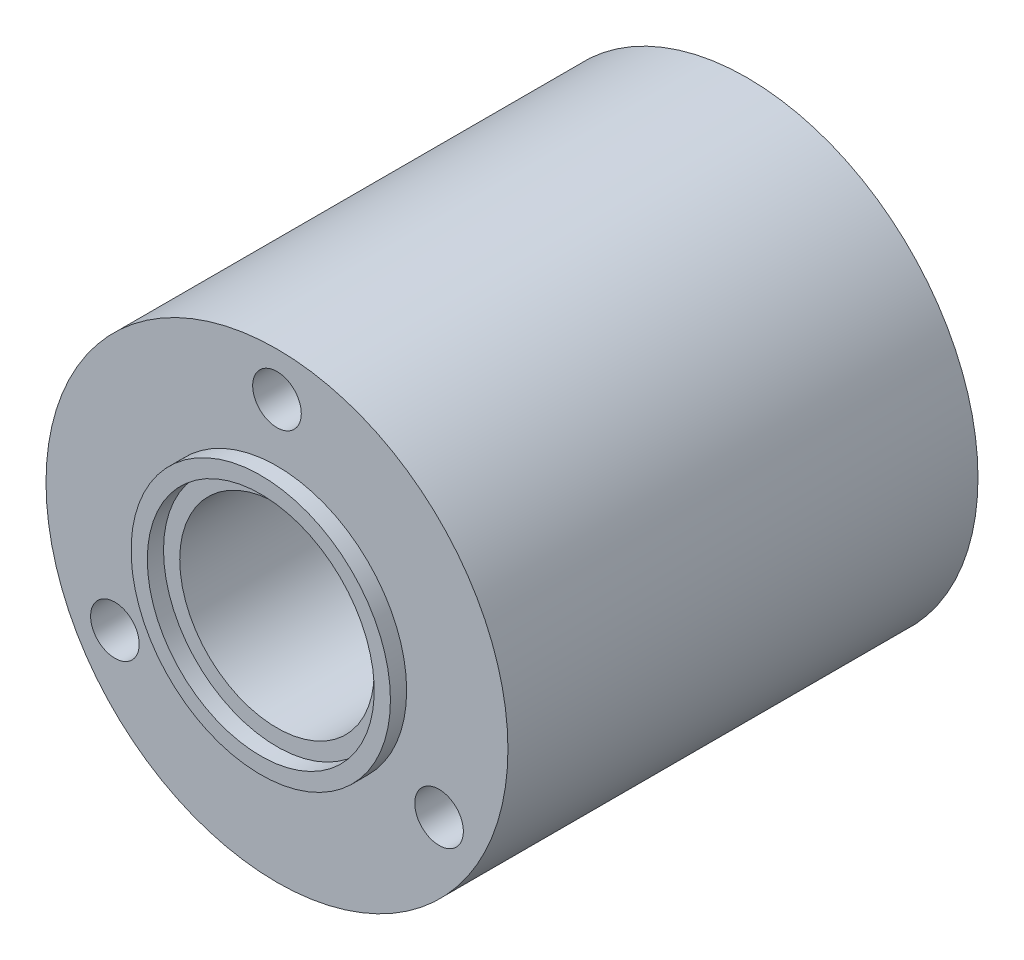
ISO-10303-21;
HEADER;
FILE_DESCRIPTION(('STEP AP214'),'2;1');
FILE_NAME('part.step','',(''),(''),'','','');
FILE_SCHEMA(('AUTOMOTIVE_DESIGN { 1 0 10303 214 1 1 1 1 }'));
ENDSEC;
DATA;
#1=APPLICATION_CONTEXT('core data for automotive mechanical design processes');
#2=APPLICATION_PROTOCOL_DEFINITION('international standard','automotive_design',2000,#1);
#3=PRODUCT_CONTEXT('',#1,'mechanical');
#4=PRODUCT('Part','Part','',(#3));
#5=PRODUCT_RELATED_PRODUCT_CATEGORY('part','',(#4));
#6=PRODUCT_DEFINITION_FORMATION('','',#4);
#7=PRODUCT_DEFINITION_CONTEXT('part definition',#1,'design');
#8=PRODUCT_DEFINITION('design','',#6,#7);
#9=PRODUCT_DEFINITION_SHAPE('','',#8);
#10=(LENGTH_UNIT() NAMED_UNIT(*) SI_UNIT(.MILLI.,.METRE.));
#11=(NAMED_UNIT(*) PLANE_ANGLE_UNIT() SI_UNIT($,.RADIAN.));
#12=(NAMED_UNIT(*) SI_UNIT($,.STERADIAN.) SOLID_ANGLE_UNIT());
#13=UNCERTAINTY_MEASURE_WITH_UNIT(LENGTH_MEASURE(1.E-05),#10,'distance_accuracy_value','');
#14=(GEOMETRIC_REPRESENTATION_CONTEXT(3) GLOBAL_UNCERTAINTY_ASSIGNED_CONTEXT((#13)) GLOBAL_UNIT_ASSIGNED_CONTEXT((#10,
#11,#12)) REPRESENTATION_CONTEXT('',''));
#15=CARTESIAN_POINT('',(0.,0.,0.));
#16=DIRECTION('',(0.,0.,1.));
#17=DIRECTION('',(1.,0.,0.));
#18=AXIS2_PLACEMENT_3D('',#15,#16,#17);
#19=CARTESIAN_POINT('',(0.,0.,29.));
#20=DIRECTION('',(0.,0.,-1.));
#21=DIRECTION('',(-1.,0.,0.));
#22=AXIS2_PLACEMENT_3D('',#19,#20,#21);
#23=CYLINDRICAL_SURFACE('',#22,7.);
#24=CARTESIAN_POINT('',(0.,0.,-1.));
#25=DIRECTION('',(0.,0.,1.));
#26=DIRECTION('',(1.,0.,0.));
#27=AXIS2_PLACEMENT_3D('',#24,#25,#26);
#28=CIRCLE('',#27,7.);
#29=CARTESIAN_POINT('',(-7.,0.,-1.));
#30=VERTEX_POINT('',#29);
#31=EDGE_CURVE('E60',#30,#30,#28,.T.);
#32=CARTESIAN_POINT('',(0.,0.,0.));
#33=DIRECTION('',(0.,0.,1.));
#34=DIRECTION('',(1.,0.,0.));
#35=AXIS2_PLACEMENT_3D('',#32,#33,#34);
#36=CIRCLE('',#35,7.);
#37=CARTESIAN_POINT('',(-7.,0.,0.));
#38=VERTEX_POINT('',#37);
#39=EDGE_CURVE('E73',#38,#38,#36,.T.);
#40=CARTESIAN_POINT('',(-7.,0.,-1.));
#41=CARTESIAN_POINT('',(-7.,0.,-0.989583333333334));
#42=CARTESIAN_POINT('',(-7.,0.,-0.979166666666668));
#43=CARTESIAN_POINT('',(-7.,0.,-0.958333333333334));
#44=CARTESIAN_POINT('',(-7.,0.,-0.947916666666668));
#45=CARTESIAN_POINT('',(-7.,0.,-0.927083333333334));
#46=CARTESIAN_POINT('',(-7.,0.,-0.916666666666668));
#47=CARTESIAN_POINT('',(-7.,0.,-0.895833333333334));
#48=CARTESIAN_POINT('',(-7.,0.,-0.885416666666668));
#49=CARTESIAN_POINT('',(-7.,0.,-0.864583333333334));
#50=CARTESIAN_POINT('',(-7.,0.,-0.854166666666667));
#51=CARTESIAN_POINT('',(-7.,0.,-0.833333333333334));
#52=CARTESIAN_POINT('',(-7.,0.,-0.822916666666667));
#53=CARTESIAN_POINT('',(-7.,0.,-0.802083333333334));
#54=CARTESIAN_POINT('',(-7.,0.,-0.791666666666667));
#55=CARTESIAN_POINT('',(-7.,0.,-0.770833333333334));
#56=CARTESIAN_POINT('',(-7.,0.,-0.760416666666667));
#57=CARTESIAN_POINT('',(-7.,0.,-0.739583333333334));
#58=CARTESIAN_POINT('',(-7.,0.,-0.729166666666667));
#59=CARTESIAN_POINT('',(-7.,0.,-0.708333333333334));
#60=CARTESIAN_POINT('',(-7.,0.,-0.697916666666667));
#61=CARTESIAN_POINT('',(-7.,0.,-0.677083333333334));
#62=CARTESIAN_POINT('',(-7.,0.,-0.666666666666667));
#63=CARTESIAN_POINT('',(-7.,0.,-0.645833333333334));
#64=CARTESIAN_POINT('',(-7.,0.,-0.635416666666667));
#65=CARTESIAN_POINT('',(-7.,0.,-0.614583333333334));
#66=CARTESIAN_POINT('',(-7.,0.,-0.604166666666667));
#67=CARTESIAN_POINT('',(-7.,0.,-0.583333333333334));
#68=CARTESIAN_POINT('',(-7.,0.,-0.572916666666667));
#69=CARTESIAN_POINT('',(-7.,0.,-0.552083333333334));
#70=CARTESIAN_POINT('',(-7.,0.,-0.541666666666667));
#71=CARTESIAN_POINT('',(-7.,0.,-0.520833333333334));
#72=CARTESIAN_POINT('',(-7.,0.,-0.510416666666667));
#73=CARTESIAN_POINT('',(-7.,0.,-0.489583333333334));
#74=CARTESIAN_POINT('',(-7.,0.,-0.479166666666667));
#75=CARTESIAN_POINT('',(-7.,0.,-0.458333333333334));
#76=CARTESIAN_POINT('',(-7.,0.,-0.447916666666667));
#77=CARTESIAN_POINT('',(-7.,0.,-0.427083333333334));
#78=CARTESIAN_POINT('',(-7.,0.,-0.416666666666667));
#79=CARTESIAN_POINT('',(-7.,0.,-0.395833333333334));
#80=CARTESIAN_POINT('',(-7.,0.,-0.385416666666667));
#81=CARTESIAN_POINT('',(-7.,0.,-0.364583333333334));
#82=CARTESIAN_POINT('',(-7.,0.,-0.354166666666667));
#83=CARTESIAN_POINT('',(-7.,0.,-0.333333333333334));
#84=CARTESIAN_POINT('',(-7.,0.,-0.322916666666667));
#85=CARTESIAN_POINT('',(-7.,0.,-0.302083333333334));
#86=CARTESIAN_POINT('',(-7.,0.,-0.291666666666667));
#87=CARTESIAN_POINT('',(-7.,0.,-0.270833333333334));
#88=CARTESIAN_POINT('',(-7.,0.,-0.260416666666667));
#89=CARTESIAN_POINT('',(-7.,0.,-0.239583333333334));
#90=CARTESIAN_POINT('',(-7.,0.,-0.229166666666667));
#91=CARTESIAN_POINT('',(-7.,0.,-0.208333333333334));
#92=CARTESIAN_POINT('',(-7.,0.,-0.197916666666667));
#93=CARTESIAN_POINT('',(-7.,0.,-0.177083333333333));
#94=CARTESIAN_POINT('',(-7.,0.,-0.166666666666667));
#95=CARTESIAN_POINT('',(-7.,0.,-0.145833333333333));
#96=CARTESIAN_POINT('',(-7.,0.,-0.135416666666667));
#97=CARTESIAN_POINT('',(-7.,0.,-0.114583333333333));
#98=CARTESIAN_POINT('',(-7.,0.,-0.104166666666667));
#99=CARTESIAN_POINT('',(-7.,0.,-0.0833333333333334));
#100=CARTESIAN_POINT('',(-7.,0.,-0.0729166666666667));
#101=CARTESIAN_POINT('',(-7.,0.,-0.0520833333333334));
#102=CARTESIAN_POINT('',(-7.,0.,-0.0416666666666667));
#103=CARTESIAN_POINT('',(-7.,0.,-0.0208333333333333));
#104=CARTESIAN_POINT('',(-7.,0.,-0.0104166666666667));
#105=CARTESIAN_POINT('',(-7.,0.,0.));
#106=B_SPLINE_CURVE_WITH_KNOTS('',3,(#40,#41,#42,#43,#44,#45,#46,#47,#48,#49,#50,#51,#52,#53,
#54,#55,#56,#57,#58,#59,#60,#61,#62,#63,#64,#65,#66,#67,#68,#69,#70,#71,#72,#73,#74,#75,#76,#77,
#78,#79,#80,#81,#82,#83,#84,#85,#86,#87,#88,#89,#90,#91,#92,#93,#94,#95,#96,#97,#98,#99,#100,
#101,#102,#103,#104,#105),.UNSPECIFIED.,.F.,.F.,(4,2,2,2,2,2,2,2,2,2,2,2,2,2,2,2,2,2,2,2,2,2,2,
2,2,2,2,2,2,2,2,2,4),(0.,0.03125,0.0625000000000001,0.0937500000000001,0.125,0.15625,0.1875,
0.21875,0.25,0.28125,0.3125,0.34375,0.375,0.40625,0.4375,0.46875,0.5,0.53125,0.5625,
0.593750000000001,0.625000000000001,0.656250000000001,0.687500000000001,0.718750000000001,
0.750000000000001,0.781250000000001,0.812500000000001,0.843750000000001,0.875000000000001,
0.906250000000001,0.937500000000001,0.968750000000001,1.),.UNSPECIFIED.);
#107=EDGE_CURVE('BSEAM35',#30,#38,#106,.T.);
#108=ORIENTED_EDGE('',*,*,#31,.F.);
#109=ORIENTED_EDGE('',*,*,#39,.T.);
#110=ORIENTED_EDGE('',*,*,#107,.T.);
#111=ORIENTED_EDGE('',*,*,#107,.F.);
#112=EDGE_LOOP('',(#108,#110,#109,#111));
#113=FACE_BOUND('',#112,.T.);
#114=ADVANCED_FACE('F35',(#113),#23,.F.);
#115=CARTESIAN_POINT('',(0.,0.,29.));
#116=DIRECTION('',(0.,0.,1.));
#117=DIRECTION('',(1.,0.,0.));
#118=AXIS2_PLACEMENT_3D('',#115,#116,#117);
#119=PLANE('',#118);
#120=CARTESIAN_POINT('',(-10.,-5.77350269189627,29.));
#121=DIRECTION('',(0.,0.,1.));
#122=DIRECTION('',(1.,0.,0.));
#123=AXIS2_PLACEMENT_3D('',#120,#121,#122);
#124=CIRCLE('',#123,1.5);
#125=CARTESIAN_POINT('',(-8.5,-5.77350269189627,29.));
#126=VERTEX_POINT('',#125);
#127=EDGE_CURVE('E67',#126,#126,#124,.T.);
#128=ORIENTED_EDGE('',*,*,#127,.F.);
#129=EDGE_LOOP('',(#128));
#130=FACE_BOUND('',#129,.T.);
#131=CARTESIAN_POINT('',(10.,-5.77350269189626,29.));
#132=DIRECTION('',(0.,0.,1.));
#133=DIRECTION('',(1.,0.,0.));
#134=AXIS2_PLACEMENT_3D('',#131,#132,#133);
#135=CIRCLE('',#134,1.5);
#136=CARTESIAN_POINT('',(11.5,-5.77350269189626,29.));
#137=VERTEX_POINT('',#136);
#138=EDGE_CURVE('E64',#137,#137,#135,.T.);
#139=ORIENTED_EDGE('',*,*,#138,.F.);
#140=EDGE_LOOP('',(#139));
#141=FACE_BOUND('',#140,.T.);
#142=CARTESIAN_POINT('',(0.,11.5470053837925,29.));
#143=DIRECTION('',(0.,0.,1.));
#144=DIRECTION('',(1.,0.,0.));
#145=AXIS2_PLACEMENT_3D('',#142,#143,#144);
#146=CIRCLE('',#145,1.5);
#147=CARTESIAN_POINT('',(1.5,11.5470053837925,29.));
#148=VERTEX_POINT('',#147);
#149=EDGE_CURVE('E61',#148,#148,#146,.T.);
#150=ORIENTED_EDGE('',*,*,#149,.F.);
#151=EDGE_LOOP('',(#150));
#152=FACE_BOUND('',#151,.T.);
#153=CARTESIAN_POINT('',(0.,0.,29.));
#154=DIRECTION('',(0.,0.,1.));
#155=DIRECTION('',(1.,0.,0.));
#156=AXIS2_PLACEMENT_3D('',#153,#154,#155);
#157=CIRCLE('',#156,14.25);
#158=CARTESIAN_POINT('',(-14.25,0.,29.));
#159=VERTEX_POINT('',#158);
#160=EDGE_CURVE('E42',#159,#159,#157,.T.);
#161=ORIENTED_EDGE('',*,*,#160,.T.);
#162=EDGE_LOOP('',(#161));
#163=FACE_BOUND('',#162,.T.);
#164=CARTESIAN_POINT('',(0.,0.,29.));
#165=DIRECTION('',(0.,0.,1.));
#166=DIRECTION('',(1.,0.,0.));
#167=AXIS2_PLACEMENT_3D('',#164,#165,#166);
#168=CIRCLE('',#167,8.);
#169=CARTESIAN_POINT('',(8.,0.,29.));
#170=VERTEX_POINT('',#169);
#171=EDGE_CURVE('E54',#170,#170,#168,.T.);
#172=ORIENTED_EDGE('',*,*,#171,.F.);
#173=EDGE_LOOP('',(#172));
#174=FACE_BOUND('',#173,.T.);
#175=ADVANCED_FACE('F102',(#130,#141,#152,#163,#174),#119,.T.);
#176=CARTESIAN_POINT('',(0.,0.,0.));
#177=DIRECTION('',(0.,0.,1.));
#178=DIRECTION('',(1.,0.,0.));
#179=AXIS2_PLACEMENT_3D('',#176,#177,#178);
#180=PLANE('',#179);
#181=CARTESIAN_POINT('',(-10.,-5.77350269189627,0.));
#182=DIRECTION('',(0.,0.,1.));
#183=DIRECTION('',(1.,0.,0.));
#184=AXIS2_PLACEMENT_3D('',#181,#182,#183);
#185=CIRCLE('',#184,1.5);
#186=CARTESIAN_POINT('',(-8.5,-5.77350269189627,0.));
#187=VERTEX_POINT('',#186);
#188=EDGE_CURVE('E65',#187,#187,#185,.T.);
#189=ORIENTED_EDGE('',*,*,#188,.T.);
#190=EDGE_LOOP('',(#189));
#191=FACE_BOUND('',#190,.T.);
#192=CARTESIAN_POINT('',(10.,-5.77350269189626,0.));
#193=DIRECTION('',(0.,0.,1.));
#194=DIRECTION('',(1.,0.,0.));
#195=AXIS2_PLACEMENT_3D('',#192,#193,#194);
#196=CIRCLE('',#195,1.5);
#197=CARTESIAN_POINT('',(11.5,-5.77350269189626,0.));
#198=VERTEX_POINT('',#197);
#199=EDGE_CURVE('E62',#198,#198,#196,.T.);
#200=ORIENTED_EDGE('',*,*,#199,.T.);
#201=EDGE_LOOP('',(#200));
#202=FACE_BOUND('',#201,.T.);
#203=CARTESIAN_POINT('',(0.,11.5470053837925,0.));
#204=DIRECTION('',(0.,0.,1.));
#205=DIRECTION('',(1.,0.,0.));
#206=AXIS2_PLACEMENT_3D('',#203,#204,#205);
#207=CIRCLE('',#206,1.5);
#208=CARTESIAN_POINT('',(1.5,11.5470053837925,0.));
#209=VERTEX_POINT('',#208);
#210=EDGE_CURVE('E57',#209,#209,#207,.T.);
#211=ORIENTED_EDGE('',*,*,#210,.T.);
#212=EDGE_LOOP('',(#211));
#213=FACE_BOUND('',#212,.T.);
#214=CARTESIAN_POINT('',(0.,0.,0.));
#215=DIRECTION('',(0.,0.,1.));
#216=DIRECTION('',(1.,0.,0.));
#217=AXIS2_PLACEMENT_3D('',#214,#215,#216);
#218=CIRCLE('',#217,8.);
#219=CARTESIAN_POINT('',(8.,0.,0.));
#220=VERTEX_POINT('',#219);
#221=EDGE_CURVE('E86',#220,#220,#218,.T.);
#222=ORIENTED_EDGE('',*,*,#221,.T.);
#223=EDGE_LOOP('',(#222));
#224=FACE_BOUND('',#223,.T.);
#225=CARTESIAN_POINT('',(0.,0.,0.));
#226=DIRECTION('',(0.,0.,1.));
#227=DIRECTION('',(1.,0.,0.));
#228=AXIS2_PLACEMENT_3D('',#225,#226,#227);
#229=CIRCLE('',#228,14.25);
#230=CARTESIAN_POINT('',(-14.25,0.,0.));
#231=VERTEX_POINT('',#230);
#232=EDGE_CURVE('E46',#231,#231,#229,.T.);
#233=ORIENTED_EDGE('',*,*,#232,.F.);
#234=EDGE_LOOP('',(#233));
#235=FACE_BOUND('',#234,.T.);
#236=ADVANCED_FACE('F104',(#191,#202,#213,#224,#235),#180,.F.);
#237=CARTESIAN_POINT('',(0.,0.,29.));
#238=DIRECTION('',(0.,0.,-1.));
#239=DIRECTION('',(-1.,0.,0.));
#240=AXIS2_PLACEMENT_3D('',#237,#238,#239);
#241=CYLINDRICAL_SURFACE('',#240,14.25);
#242=CARTESIAN_POINT('',(-14.25,0.,29.));
#243=CARTESIAN_POINT('',(-14.25,0.,28.6979166666667));
#244=CARTESIAN_POINT('',(-14.25,0.,28.3958333333333));
#245=CARTESIAN_POINT('',(-14.25,0.,27.7916666666667));
#246=CARTESIAN_POINT('',(-14.25,0.,27.4895833333333));
#247=CARTESIAN_POINT('',(-14.25,0.,26.8854166666667));
#248=CARTESIAN_POINT('',(-14.25,0.,26.5833333333333));
#249=CARTESIAN_POINT('',(-14.25,0.,25.9791666666667));
#250=CARTESIAN_POINT('',(-14.25,0.,25.6770833333333));
#251=CARTESIAN_POINT('',(-14.25,0.,25.0729166666667));
#252=CARTESIAN_POINT('',(-14.25,0.,24.7708333333333));
#253=CARTESIAN_POINT('',(-14.25,0.,24.1666666666667));
#254=CARTESIAN_POINT('',(-14.25,0.,23.8645833333333));
#255=CARTESIAN_POINT('',(-14.25,0.,23.2604166666667));
#256=CARTESIAN_POINT('',(-14.25,0.,22.9583333333333));
#257=CARTESIAN_POINT('',(-14.25,0.,22.3541666666667));
#258=CARTESIAN_POINT('',(-14.25,0.,22.0520833333333));
#259=CARTESIAN_POINT('',(-14.25,0.,21.4479166666667));
#260=CARTESIAN_POINT('',(-14.25,0.,21.1458333333333));
#261=CARTESIAN_POINT('',(-14.25,0.,20.5416666666667));
#262=CARTESIAN_POINT('',(-14.25,0.,20.2395833333333));
#263=CARTESIAN_POINT('',(-14.25,0.,19.6354166666667));
#264=CARTESIAN_POINT('',(-14.25,0.,19.3333333333333));
#265=CARTESIAN_POINT('',(-14.25,0.,18.7291666666667));
#266=CARTESIAN_POINT('',(-14.25,0.,18.4270833333333));
#267=CARTESIAN_POINT('',(-14.25,0.,17.8229166666667));
#268=CARTESIAN_POINT('',(-14.25,0.,17.5208333333333));
#269=CARTESIAN_POINT('',(-14.25,0.,16.9166666666667));
#270=CARTESIAN_POINT('',(-14.25,0.,16.6145833333333));
#271=CARTESIAN_POINT('',(-14.25,0.,16.0104166666667));
#272=CARTESIAN_POINT('',(-14.25,0.,15.7083333333333));
#273=CARTESIAN_POINT('',(-14.25,0.,15.1041666666667));
#274=CARTESIAN_POINT('',(-14.25,0.,14.8020833333333));
#275=CARTESIAN_POINT('',(-14.25,0.,14.1979166666667));
#276=CARTESIAN_POINT('',(-14.25,0.,13.8958333333333));
#277=CARTESIAN_POINT('',(-14.25,0.,13.2916666666667));
#278=CARTESIAN_POINT('',(-14.25,0.,12.9895833333333));
#279=CARTESIAN_POINT('',(-14.25,0.,12.3854166666667));
#280=CARTESIAN_POINT('',(-14.25,0.,12.0833333333333));
#281=CARTESIAN_POINT('',(-14.25,0.,11.4791666666667));
#282=CARTESIAN_POINT('',(-14.25,0.,11.1770833333333));
#283=CARTESIAN_POINT('',(-14.25,0.,10.5729166666667));
#284=CARTESIAN_POINT('',(-14.25,0.,10.2708333333333));
#285=CARTESIAN_POINT('',(-14.25,0.,9.66666666666667));
#286=CARTESIAN_POINT('',(-14.25,0.,9.36458333333333));
#287=CARTESIAN_POINT('',(-14.25,0.,8.76041666666667));
#288=CARTESIAN_POINT('',(-14.25,0.,8.45833333333333));
#289=CARTESIAN_POINT('',(-14.25,0.,7.85416666666667));
#290=CARTESIAN_POINT('',(-14.25,0.,7.55208333333333));
#291=CARTESIAN_POINT('',(-14.25,0.,6.94791666666667));
#292=CARTESIAN_POINT('',(-14.25,0.,6.64583333333333));
#293=CARTESIAN_POINT('',(-14.25,0.,6.04166666666667));
#294=CARTESIAN_POINT('',(-14.25,0.,5.73958333333333));
#295=CARTESIAN_POINT('',(-14.25,0.,5.13541666666667));
#296=CARTESIAN_POINT('',(-14.25,0.,4.83333333333333));
#297=CARTESIAN_POINT('',(-14.25,0.,4.22916666666667));
#298=CARTESIAN_POINT('',(-14.25,0.,3.92708333333333));
#299=CARTESIAN_POINT('',(-14.25,0.,3.32291666666667));
#300=CARTESIAN_POINT('',(-14.25,0.,3.02083333333333));
#301=CARTESIAN_POINT('',(-14.25,0.,2.41666666666667));
#302=CARTESIAN_POINT('',(-14.25,0.,2.11458333333333));
#303=CARTESIAN_POINT('',(-14.25,0.,1.51041666666667));
#304=CARTESIAN_POINT('',(-14.25,0.,1.20833333333333));
#305=CARTESIAN_POINT('',(-14.25,0.,0.604166666666667));
#306=CARTESIAN_POINT('',(-14.25,0.,0.302083333333333));
#307=CARTESIAN_POINT('',(-14.25,0.,0.));
#308=B_SPLINE_CURVE_WITH_KNOTS('',3,(#242,#243,#244,#245,#246,#247,#248,#249,#250,#251,#252,
#253,#254,#255,#256,#257,#258,#259,#260,#261,#262,#263,#264,#265,#266,#267,#268,#269,#270,#271,
#272,#273,#274,#275,#276,#277,#278,#279,#280,#281,#282,#283,#284,#285,#286,#287,#288,#289,#290,
#291,#292,#293,#294,#295,#296,#297,#298,#299,#300,#301,#302,#303,#304,#305,#306,#307),
.UNSPECIFIED.,.F.,.F.,(4,2,2,2,2,2,2,2,2,2,2,2,2,2,2,2,2,2,2,2,2,2,2,2,2,2,2,2,2,2,2,2,4),(0.,
0.906250000000001,1.8125,2.71875,3.625,4.53125,5.4375,6.34375,7.25,8.15625,9.0625,9.96875,
10.875,11.78125,12.6875,13.59375,14.5,15.40625,16.3125,17.21875,18.125,19.03125,19.9375,
20.84375,21.75,22.65625,23.5625,24.46875,25.375,26.28125,27.1875,28.09375,29.),.UNSPECIFIED.);
#309=EDGE_CURVE('BSEAM37',#159,#231,#308,.T.);
#310=ORIENTED_EDGE('',*,*,#160,.F.);
#311=ORIENTED_EDGE('',*,*,#232,.T.);
#312=ORIENTED_EDGE('',*,*,#309,.T.);
#313=ORIENTED_EDGE('',*,*,#309,.F.);
#314=EDGE_LOOP('',(#310,#312,#311,#313));
#315=FACE_BOUND('',#314,.T.);
#316=ADVANCED_FACE('F37',(#315),#241,.T.);
#317=CARTESIAN_POINT('',(0.,0.,29.));
#318=DIRECTION('',(0.,0.,1.));
#319=DIRECTION('',(1.,0.,0.));
#320=AXIS2_PLACEMENT_3D('',#317,#318,#319);
#321=CIRCLE('',#320,7.);
#322=CARTESIAN_POINT('',(-7.,0.,29.));
#323=VERTEX_POINT('',#322);
#324=EDGE_CURVE('E10',#323,#323,#321,.T.);
#325=CARTESIAN_POINT('',(0.,0.,30.));
#326=DIRECTION('',(0.,0.,1.));
#327=DIRECTION('',(1.,0.,0.));
#328=AXIS2_PLACEMENT_3D('',#325,#326,#327);
#329=CIRCLE('',#328,7.);
#330=CARTESIAN_POINT('',(-7.,0.,30.));
#331=VERTEX_POINT('',#330);
#332=EDGE_CURVE('E90',#331,#331,#329,.T.);
#333=CARTESIAN_POINT('',(-7.,0.,29.));
#334=CARTESIAN_POINT('',(-7.,0.,29.0104166666667));
#335=CARTESIAN_POINT('',(-7.,0.,29.0208333333333));
#336=CARTESIAN_POINT('',(-7.,0.,29.0416666666667));
#337=CARTESIAN_POINT('',(-7.,0.,29.0520833333333));
#338=CARTESIAN_POINT('',(-7.,0.,29.0729166666667));
#339=CARTESIAN_POINT('',(-7.,0.,29.0833333333333));
#340=CARTESIAN_POINT('',(-7.,0.,29.1041666666667));
#341=CARTESIAN_POINT('',(-7.,0.,29.1145833333333));
#342=CARTESIAN_POINT('',(-7.,0.,29.1354166666667));
#343=CARTESIAN_POINT('',(-7.,0.,29.1458333333333));
#344=CARTESIAN_POINT('',(-7.,0.,29.1666666666667));
#345=CARTESIAN_POINT('',(-7.,0.,29.1770833333333));
#346=CARTESIAN_POINT('',(-7.,0.,29.1979166666667));
#347=CARTESIAN_POINT('',(-7.,0.,29.2083333333333));
#348=CARTESIAN_POINT('',(-7.,0.,29.2291666666667));
#349=CARTESIAN_POINT('',(-7.,0.,29.2395833333333));
#350=CARTESIAN_POINT('',(-7.,0.,29.2604166666667));
#351=CARTESIAN_POINT('',(-7.,0.,29.2708333333333));
#352=CARTESIAN_POINT('',(-7.,0.,29.2916666666667));
#353=CARTESIAN_POINT('',(-7.,0.,29.3020833333333));
#354=CARTESIAN_POINT('',(-7.,0.,29.3229166666667));
#355=CARTESIAN_POINT('',(-7.,0.,29.3333333333333));
#356=CARTESIAN_POINT('',(-7.,0.,29.3541666666667));
#357=CARTESIAN_POINT('',(-7.,0.,29.3645833333333));
#358=CARTESIAN_POINT('',(-7.,0.,29.3854166666667));
#359=CARTESIAN_POINT('',(-7.,0.,29.3958333333333));
#360=CARTESIAN_POINT('',(-7.,0.,29.4166666666667));
#361=CARTESIAN_POINT('',(-7.,0.,29.4270833333333));
#362=CARTESIAN_POINT('',(-7.,0.,29.4479166666667));
#363=CARTESIAN_POINT('',(-7.,0.,29.4583333333333));
#364=CARTESIAN_POINT('',(-7.,0.,29.4791666666667));
#365=CARTESIAN_POINT('',(-7.,0.,29.4895833333333));
#366=CARTESIAN_POINT('',(-7.,0.,29.5104166666667));
#367=CARTESIAN_POINT('',(-7.,0.,29.5208333333333));
#368=CARTESIAN_POINT('',(-7.,0.,29.5416666666667));
#369=CARTESIAN_POINT('',(-7.,0.,29.5520833333333));
#370=CARTESIAN_POINT('',(-7.,0.,29.5729166666667));
#371=CARTESIAN_POINT('',(-7.,0.,29.5833333333333));
#372=CARTESIAN_POINT('',(-7.,0.,29.6041666666667));
#373=CARTESIAN_POINT('',(-7.,0.,29.6145833333333));
#374=CARTESIAN_POINT('',(-7.,0.,29.6354166666667));
#375=CARTESIAN_POINT('',(-7.,0.,29.6458333333333));
#376=CARTESIAN_POINT('',(-7.,0.,29.6666666666667));
#377=CARTESIAN_POINT('',(-7.,0.,29.6770833333333));
#378=CARTESIAN_POINT('',(-7.,0.,29.6979166666667));
#379=CARTESIAN_POINT('',(-7.,0.,29.7083333333333));
#380=CARTESIAN_POINT('',(-7.,0.,29.7291666666667));
#381=CARTESIAN_POINT('',(-7.,0.,29.7395833333333));
#382=CARTESIAN_POINT('',(-7.,0.,29.7604166666667));
#383=CARTESIAN_POINT('',(-7.,0.,29.7708333333333));
#384=CARTESIAN_POINT('',(-7.,0.,29.7916666666667));
#385=CARTESIAN_POINT('',(-7.,0.,29.8020833333333));
#386=CARTESIAN_POINT('',(-7.,0.,29.8229166666667));
#387=CARTESIAN_POINT('',(-7.,0.,29.8333333333333));
#388=CARTESIAN_POINT('',(-7.,0.,29.8541666666667));
#389=CARTESIAN_POINT('',(-7.,0.,29.8645833333333));
#390=CARTESIAN_POINT('',(-7.,0.,29.8854166666667));
#391=CARTESIAN_POINT('',(-7.,0.,29.8958333333333));
#392=CARTESIAN_POINT('',(-7.,0.,29.9166666666667));
#393=CARTESIAN_POINT('',(-7.,0.,29.9270833333333));
#394=CARTESIAN_POINT('',(-7.,0.,29.9479166666667));
#395=CARTESIAN_POINT('',(-7.,0.,29.9583333333333));
#396=CARTESIAN_POINT('',(-7.,0.,29.9791666666667));
#397=CARTESIAN_POINT('',(-7.,0.,29.9895833333333));
#398=CARTESIAN_POINT('',(-7.,0.,30.));
#399=B_SPLINE_CURVE_WITH_KNOTS('',3,(#333,#334,#335,#336,#337,#338,#339,#340,#341,#342,#343,
#344,#345,#346,#347,#348,#349,#350,#351,#352,#353,#354,#355,#356,#357,#358,#359,#360,#361,#362,
#363,#364,#365,#366,#367,#368,#369,#370,#371,#372,#373,#374,#375,#376,#377,#378,#379,#380,#381,
#382,#383,#384,#385,#386,#387,#388,#389,#390,#391,#392,#393,#394,#395,#396,#397,#398),
.UNSPECIFIED.,.F.,.F.,(4,2,2,2,2,2,2,2,2,2,2,2,2,2,2,2,2,2,2,2,2,2,2,2,2,2,2,2,2,2,2,2,4),(0.,
0.03125,0.0625000000000001,0.0937500000000001,0.125,0.15625,0.1875,0.21875,0.25,0.28125,0.3125,
0.34375,0.375,0.40625,0.4375,0.46875,0.5,0.53125,0.5625,0.593750000000001,0.625000000000001,
0.656250000000001,0.687500000000001,0.718750000000001,0.750000000000001,0.781250000000001,
0.812500000000001,0.843750000000001,0.875000000000001,0.906250000000001,0.937500000000001,
0.968750000000001,1.),.UNSPECIFIED.);
#400=EDGE_CURVE('BSEAM113',#323,#331,#399,.T.);
#401=ORIENTED_EDGE('',*,*,#324,.F.);
#402=ORIENTED_EDGE('',*,*,#332,.T.);
#403=ORIENTED_EDGE('',*,*,#400,.T.);
#404=ORIENTED_EDGE('',*,*,#400,.F.);
#405=EDGE_LOOP('',(#401,#403,#402,#404));
#406=FACE_BOUND('',#405,.T.);
#407=ADVANCED_FACE('F113',(#406),#23,.F.);
#408=CARTESIAN_POINT('',(0.,0.,30.));
#409=DIRECTION('',(0.,0.,1.));
#410=DIRECTION('',(1.,0.,0.));
#411=AXIS2_PLACEMENT_3D('',#408,#409,#410);
#412=PLANE('',#411);
#413=CARTESIAN_POINT('',(0.,0.,30.));
#414=DIRECTION('',(0.,0.,1.));
#415=DIRECTION('',(1.,0.,0.));
#416=AXIS2_PLACEMENT_3D('',#413,#414,#415);
#417=CIRCLE('',#416,8.);
#418=CARTESIAN_POINT('',(8.,0.,30.));
#419=VERTEX_POINT('',#418);
#420=EDGE_CURVE('E51',#419,#419,#417,.T.);
#421=ORIENTED_EDGE('',*,*,#420,.T.);
#422=EDGE_LOOP('',(#421));
#423=FACE_BOUND('',#422,.T.);
#424=ORIENTED_EDGE('',*,*,#332,.F.);
#425=EDGE_LOOP('',(#424));
#426=FACE_BOUND('',#425,.T.);
#427=ADVANCED_FACE('F117',(#423,#426),#412,.T.);
#428=CARTESIAN_POINT('',(0.,0.,30.));
#429=DIRECTION('',(0.,0.,-1.));
#430=DIRECTION('',(-1.,0.,0.));
#431=AXIS2_PLACEMENT_3D('',#428,#429,#430);
#432=CYLINDRICAL_SURFACE('',#431,8.);
#433=ORIENTED_EDGE('',*,*,#420,.F.);
#434=EDGE_LOOP('',(#433));
#435=FACE_BOUND('',#434,.T.);
#436=ORIENTED_EDGE('',*,*,#171,.T.);
#437=EDGE_LOOP('',(#436));
#438=FACE_BOUND('',#437,.T.);
#439=ADVANCED_FACE('F100',(#435,#438),#432,.T.);
#440=CARTESIAN_POINT('',(0.,0.,-1.));
#441=DIRECTION('',(0.,0.,1.));
#442=DIRECTION('',(1.,0.,0.));
#443=AXIS2_PLACEMENT_3D('',#440,#441,#442);
#444=CYLINDRICAL_SURFACE('',#443,8.);
#445=CARTESIAN_POINT('',(0.,0.,-1.));
#446=DIRECTION('',(0.,0.,1.));
#447=DIRECTION('',(1.,0.,0.));
#448=AXIS2_PLACEMENT_3D('',#445,#446,#447);
#449=CIRCLE('',#448,8.);
#450=CARTESIAN_POINT('',(8.,0.,-1.));
#451=VERTEX_POINT('',#450);
#452=EDGE_CURVE('E87',#451,#451,#449,.T.);
#453=ORIENTED_EDGE('',*,*,#452,.T.);
#454=EDGE_LOOP('',(#453));
#455=FACE_BOUND('',#454,.T.);
#456=ORIENTED_EDGE('',*,*,#221,.F.);
#457=EDGE_LOOP('',(#456));
#458=FACE_BOUND('',#457,.T.);
#459=ADVANCED_FACE('F121',(#455,#458),#444,.T.);
#460=CARTESIAN_POINT('',(0.,0.,-1.));
#461=DIRECTION('',(0.,0.,-1.));
#462=DIRECTION('',(1.,0.,0.));
#463=AXIS2_PLACEMENT_3D('',#460,#461,#462);
#464=PLANE('',#463);
#465=ORIENTED_EDGE('',*,*,#31,.T.);
#466=EDGE_LOOP('',(#465));
#467=FACE_BOUND('',#466,.T.);
#468=ORIENTED_EDGE('',*,*,#452,.F.);
#469=EDGE_LOOP('',(#468));
#470=FACE_BOUND('',#469,.T.);
#471=ADVANCED_FACE('F127',(#467,#470),#464,.T.);
#472=CARTESIAN_POINT('',(0.,11.5470053837925,-1.));
#473=DIRECTION('',(0.,0.,1.));
#474=DIRECTION('',(1.,0.,0.));
#475=AXIS2_PLACEMENT_3D('',#472,#473,#474);
#476=CYLINDRICAL_SURFACE('',#475,1.5);
#477=CARTESIAN_POINT('',(1.5,11.5470053837925,29.));
#478=CARTESIAN_POINT('',(1.5,11.5470053837925,28.6979166666667));
#479=CARTESIAN_POINT('',(1.5,11.5470053837925,28.3958333333333));
#480=CARTESIAN_POINT('',(1.5,11.5470053837925,27.7916666666667));
#481=CARTESIAN_POINT('',(1.5,11.5470053837925,27.4895833333333));
#482=CARTESIAN_POINT('',(1.5,11.5470053837925,26.8854166666667));
#483=CARTESIAN_POINT('',(1.5,11.5470053837925,26.5833333333333));
#484=CARTESIAN_POINT('',(1.5,11.5470053837925,25.9791666666667));
#485=CARTESIAN_POINT('',(1.5,11.5470053837925,25.6770833333333));
#486=CARTESIAN_POINT('',(1.5,11.5470053837925,25.0729166666667));
#487=CARTESIAN_POINT('',(1.5,11.5470053837925,24.7708333333333));
#488=CARTESIAN_POINT('',(1.5,11.5470053837925,24.1666666666667));
#489=CARTESIAN_POINT('',(1.5,11.5470053837925,23.8645833333333));
#490=CARTESIAN_POINT('',(1.5,11.5470053837925,23.2604166666667));
#491=CARTESIAN_POINT('',(1.5,11.5470053837925,22.9583333333333));
#492=CARTESIAN_POINT('',(1.5,11.5470053837925,22.3541666666667));
#493=CARTESIAN_POINT('',(1.5,11.5470053837925,22.0520833333333));
#494=CARTESIAN_POINT('',(1.5,11.5470053837925,21.4479166666667));
#495=CARTESIAN_POINT('',(1.5,11.5470053837925,21.1458333333333));
#496=CARTESIAN_POINT('',(1.5,11.5470053837925,20.5416666666667));
#497=CARTESIAN_POINT('',(1.5,11.5470053837925,20.2395833333333));
#498=CARTESIAN_POINT('',(1.5,11.5470053837925,19.6354166666667));
#499=CARTESIAN_POINT('',(1.5,11.5470053837925,19.3333333333333));
#500=CARTESIAN_POINT('',(1.5,11.5470053837925,18.7291666666667));
#501=CARTESIAN_POINT('',(1.5,11.5470053837925,18.4270833333333));
#502=CARTESIAN_POINT('',(1.5,11.5470053837925,17.8229166666667));
#503=CARTESIAN_POINT('',(1.5,11.5470053837925,17.5208333333333));
#504=CARTESIAN_POINT('',(1.5,11.5470053837925,16.9166666666667));
#505=CARTESIAN_POINT('',(1.5,11.5470053837925,16.6145833333333));
#506=CARTESIAN_POINT('',(1.5,11.5470053837925,16.0104166666667));
#507=CARTESIAN_POINT('',(1.5,11.5470053837925,15.7083333333333));
#508=CARTESIAN_POINT('',(1.5,11.5470053837925,15.1041666666667));
#509=CARTESIAN_POINT('',(1.5,11.5470053837925,14.8020833333333));
#510=CARTESIAN_POINT('',(1.5,11.5470053837925,14.1979166666667));
#511=CARTESIAN_POINT('',(1.5,11.5470053837925,13.8958333333333));
#512=CARTESIAN_POINT('',(1.5,11.5470053837925,13.2916666666667));
#513=CARTESIAN_POINT('',(1.5,11.5470053837925,12.9895833333333));
#514=CARTESIAN_POINT('',(1.5,11.5470053837925,12.3854166666667));
#515=CARTESIAN_POINT('',(1.5,11.5470053837925,12.0833333333333));
#516=CARTESIAN_POINT('',(1.5,11.5470053837925,11.4791666666667));
#517=CARTESIAN_POINT('',(1.5,11.5470053837925,11.1770833333333));
#518=CARTESIAN_POINT('',(1.5,11.5470053837925,10.5729166666667));
#519=CARTESIAN_POINT('',(1.5,11.5470053837925,10.2708333333333));
#520=CARTESIAN_POINT('',(1.5,11.5470053837925,9.66666666666667));
#521=CARTESIAN_POINT('',(1.5,11.5470053837925,9.36458333333333));
#522=CARTESIAN_POINT('',(1.5,11.5470053837925,8.76041666666667));
#523=CARTESIAN_POINT('',(1.5,11.5470053837925,8.45833333333333));
#524=CARTESIAN_POINT('',(1.5,11.5470053837925,7.85416666666667));
#525=CARTESIAN_POINT('',(1.5,11.5470053837925,7.55208333333333));
#526=CARTESIAN_POINT('',(1.5,11.5470053837925,6.94791666666667));
#527=CARTESIAN_POINT('',(1.5,11.5470053837925,6.64583333333333));
#528=CARTESIAN_POINT('',(1.5,11.5470053837925,6.04166666666667));
#529=CARTESIAN_POINT('',(1.5,11.5470053837925,5.73958333333333));
#530=CARTESIAN_POINT('',(1.5,11.5470053837925,5.13541666666667));
#531=CARTESIAN_POINT('',(1.5,11.5470053837925,4.83333333333333));
#532=CARTESIAN_POINT('',(1.5,11.5470053837925,4.22916666666667));
#533=CARTESIAN_POINT('',(1.5,11.5470053837925,3.92708333333333));
#534=CARTESIAN_POINT('',(1.5,11.5470053837925,3.32291666666667));
#535=CARTESIAN_POINT('',(1.5,11.5470053837925,3.02083333333333));
#536=CARTESIAN_POINT('',(1.5,11.5470053837925,2.41666666666667));
#537=CARTESIAN_POINT('',(1.5,11.5470053837925,2.11458333333333));
#538=CARTESIAN_POINT('',(1.5,11.5470053837925,1.51041666666667));
#539=CARTESIAN_POINT('',(1.5,11.5470053837925,1.20833333333333));
#540=CARTESIAN_POINT('',(1.5,11.5470053837925,0.604166666666667));
#541=CARTESIAN_POINT('',(1.5,11.5470053837925,0.302083333333334));
#542=CARTESIAN_POINT('',(1.5,11.5470053837925,0.));
#543=B_SPLINE_CURVE_WITH_KNOTS('',3,(#477,#478,#479,#480,#481,#482,#483,#484,#485,#486,#487,
#488,#489,#490,#491,#492,#493,#494,#495,#496,#497,#498,#499,#500,#501,#502,#503,#504,#505,#506,
#507,#508,#509,#510,#511,#512,#513,#514,#515,#516,#517,#518,#519,#520,#521,#522,#523,#524,#525,
#526,#527,#528,#529,#530,#531,#532,#533,#534,#535,#536,#537,#538,#539,#540,#541,#542),
.UNSPECIFIED.,.F.,.F.,(4,2,2,2,2,2,2,2,2,2,2,2,2,2,2,2,2,2,2,2,2,2,2,2,2,2,2,2,2,2,2,2,4),(0.,
0.906250000000001,1.8125,2.71875,3.625,4.53125,5.4375,6.34375,7.25,8.15625,9.0625,9.96875,
10.875,11.78125,12.6875,13.59375,14.5,15.40625,16.3125,17.21875,18.125,19.03125,19.9375,
20.84375,21.75,22.65625,23.5625,24.46875,25.375,26.28125,27.1875,28.09375,29.),.UNSPECIFIED.);
#544=EDGE_CURVE('BSEAM131',#148,#209,#543,.T.);
#545=ORIENTED_EDGE('',*,*,#149,.T.);
#546=ORIENTED_EDGE('',*,*,#210,.F.);
#547=ORIENTED_EDGE('',*,*,#544,.T.);
#548=ORIENTED_EDGE('',*,*,#544,.F.);
#549=EDGE_LOOP('',(#545,#547,#546,#548));
#550=FACE_BOUND('',#549,.T.);
#551=ADVANCED_FACE('F131',(#550),#476,.F.);
#552=CARTESIAN_POINT('',(10.,-5.77350269189626,-1.));
#553=DIRECTION('',(0.,0.,1.));
#554=DIRECTION('',(1.,0.,0.));
#555=AXIS2_PLACEMENT_3D('',#552,#553,#554);
#556=CYLINDRICAL_SURFACE('',#555,1.5);
#557=CARTESIAN_POINT('',(11.5,-5.77350269189626,29.));
#558=CARTESIAN_POINT('',(11.5,-5.77350269189626,28.6979166666667));
#559=CARTESIAN_POINT('',(11.5,-5.77350269189626,28.3958333333333));
#560=CARTESIAN_POINT('',(11.5,-5.77350269189626,27.7916666666667));
#561=CARTESIAN_POINT('',(11.5,-5.77350269189626,27.4895833333333));
#562=CARTESIAN_POINT('',(11.5,-5.77350269189626,26.8854166666667));
#563=CARTESIAN_POINT('',(11.5,-5.77350269189626,26.5833333333333));
#564=CARTESIAN_POINT('',(11.5,-5.77350269189626,25.9791666666667));
#565=CARTESIAN_POINT('',(11.5,-5.77350269189626,25.6770833333333));
#566=CARTESIAN_POINT('',(11.5,-5.77350269189626,25.0729166666667));
#567=CARTESIAN_POINT('',(11.5,-5.77350269189626,24.7708333333333));
#568=CARTESIAN_POINT('',(11.5,-5.77350269189626,24.1666666666667));
#569=CARTESIAN_POINT('',(11.5,-5.77350269189626,23.8645833333333));
#570=CARTESIAN_POINT('',(11.5,-5.77350269189626,23.2604166666667));
#571=CARTESIAN_POINT('',(11.5,-5.77350269189626,22.9583333333333));
#572=CARTESIAN_POINT('',(11.5,-5.77350269189626,22.3541666666667));
#573=CARTESIAN_POINT('',(11.5,-5.77350269189626,22.0520833333333));
#574=CARTESIAN_POINT('',(11.5,-5.77350269189626,21.4479166666667));
#575=CARTESIAN_POINT('',(11.5,-5.77350269189626,21.1458333333333));
#576=CARTESIAN_POINT('',(11.5,-5.77350269189626,20.5416666666667));
#577=CARTESIAN_POINT('',(11.5,-5.77350269189626,20.2395833333333));
#578=CARTESIAN_POINT('',(11.5,-5.77350269189626,19.6354166666667));
#579=CARTESIAN_POINT('',(11.5,-5.77350269189626,19.3333333333333));
#580=CARTESIAN_POINT('',(11.5,-5.77350269189626,18.7291666666667));
#581=CARTESIAN_POINT('',(11.5,-5.77350269189626,18.4270833333333));
#582=CARTESIAN_POINT('',(11.5,-5.77350269189626,17.8229166666667));
#583=CARTESIAN_POINT('',(11.5,-5.77350269189626,17.5208333333333));
#584=CARTESIAN_POINT('',(11.5,-5.77350269189626,16.9166666666667));
#585=CARTESIAN_POINT('',(11.5,-5.77350269189626,16.6145833333333));
#586=CARTESIAN_POINT('',(11.5,-5.77350269189626,16.0104166666667));
#587=CARTESIAN_POINT('',(11.5,-5.77350269189626,15.7083333333333));
#588=CARTESIAN_POINT('',(11.5,-5.77350269189626,15.1041666666667));
#589=CARTESIAN_POINT('',(11.5,-5.77350269189626,14.8020833333333));
#590=CARTESIAN_POINT('',(11.5,-5.77350269189626,14.1979166666667));
#591=CARTESIAN_POINT('',(11.5,-5.77350269189626,13.8958333333333));
#592=CARTESIAN_POINT('',(11.5,-5.77350269189626,13.2916666666667));
#593=CARTESIAN_POINT('',(11.5,-5.77350269189626,12.9895833333333));
#594=CARTESIAN_POINT('',(11.5,-5.77350269189626,12.3854166666667));
#595=CARTESIAN_POINT('',(11.5,-5.77350269189626,12.0833333333333));
#596=CARTESIAN_POINT('',(11.5,-5.77350269189626,11.4791666666667));
#597=CARTESIAN_POINT('',(11.5,-5.77350269189626,11.1770833333333));
#598=CARTESIAN_POINT('',(11.5,-5.77350269189626,10.5729166666667));
#599=CARTESIAN_POINT('',(11.5,-5.77350269189626,10.2708333333333));
#600=CARTESIAN_POINT('',(11.5,-5.77350269189626,9.66666666666667));
#601=CARTESIAN_POINT('',(11.5,-5.77350269189626,9.36458333333333));
#602=CARTESIAN_POINT('',(11.5,-5.77350269189626,8.76041666666667));
#603=CARTESIAN_POINT('',(11.5,-5.77350269189626,8.45833333333333));
#604=CARTESIAN_POINT('',(11.5,-5.77350269189626,7.85416666666667));
#605=CARTESIAN_POINT('',(11.5,-5.77350269189626,7.55208333333333));
#606=CARTESIAN_POINT('',(11.5,-5.77350269189626,6.94791666666667));
#607=CARTESIAN_POINT('',(11.5,-5.77350269189626,6.64583333333333));
#608=CARTESIAN_POINT('',(11.5,-5.77350269189626,6.04166666666667));
#609=CARTESIAN_POINT('',(11.5,-5.77350269189626,5.73958333333333));
#610=CARTESIAN_POINT('',(11.5,-5.77350269189626,5.13541666666667));
#611=CARTESIAN_POINT('',(11.5,-5.77350269189626,4.83333333333333));
#612=CARTESIAN_POINT('',(11.5,-5.77350269189626,4.22916666666667));
#613=CARTESIAN_POINT('',(11.5,-5.77350269189626,3.92708333333333));
#614=CARTESIAN_POINT('',(11.5,-5.77350269189626,3.32291666666667));
#615=CARTESIAN_POINT('',(11.5,-5.77350269189626,3.02083333333333));
#616=CARTESIAN_POINT('',(11.5,-5.77350269189626,2.41666666666667));
#617=CARTESIAN_POINT('',(11.5,-5.77350269189626,2.11458333333333));
#618=CARTESIAN_POINT('',(11.5,-5.77350269189626,1.51041666666667));
#619=CARTESIAN_POINT('',(11.5,-5.77350269189626,1.20833333333333));
#620=CARTESIAN_POINT('',(11.5,-5.77350269189626,0.604166666666667));
#621=CARTESIAN_POINT('',(11.5,-5.77350269189626,0.302083333333334));
#622=CARTESIAN_POINT('',(11.5,-5.77350269189626,0.));
#623=B_SPLINE_CURVE_WITH_KNOTS('',3,(#557,#558,#559,#560,#561,#562,#563,#564,#565,#566,#567,
#568,#569,#570,#571,#572,#573,#574,#575,#576,#577,#578,#579,#580,#581,#582,#583,#584,#585,#586,
#587,#588,#589,#590,#591,#592,#593,#594,#595,#596,#597,#598,#599,#600,#601,#602,#603,#604,#605,
#606,#607,#608,#609,#610,#611,#612,#613,#614,#615,#616,#617,#618,#619,#620,#621,#622),
.UNSPECIFIED.,.F.,.F.,(4,2,2,2,2,2,2,2,2,2,2,2,2,2,2,2,2,2,2,2,2,2,2,2,2,2,2,2,2,2,2,2,4),(0.,
0.906250000000001,1.8125,2.71875,3.625,4.53125,5.4375,6.34375,7.25,8.15625,9.0625,9.96875,
10.875,11.78125,12.6875,13.59375,14.5,15.40625,16.3125,17.21875,18.125,19.03125,19.9375,
20.84375,21.75,22.65625,23.5625,24.46875,25.375,26.28125,27.1875,28.09375,29.),.UNSPECIFIED.);
#624=EDGE_CURVE('BSEAM135',#137,#198,#623,.T.);
#625=ORIENTED_EDGE('',*,*,#138,.T.);
#626=ORIENTED_EDGE('',*,*,#199,.F.);
#627=ORIENTED_EDGE('',*,*,#624,.T.);
#628=ORIENTED_EDGE('',*,*,#624,.F.);
#629=EDGE_LOOP('',(#625,#627,#626,#628));
#630=FACE_BOUND('',#629,.T.);
#631=ADVANCED_FACE('F135',(#630),#556,.F.);
#632=CARTESIAN_POINT('',(-10.,-5.77350269189627,-1.));
#633=DIRECTION('',(0.,0.,1.));
#634=DIRECTION('',(1.,0.,0.));
#635=AXIS2_PLACEMENT_3D('',#632,#633,#634);
#636=CYLINDRICAL_SURFACE('',#635,1.5);
#637=CARTESIAN_POINT('',(-8.5,-5.77350269189627,29.));
#638=CARTESIAN_POINT('',(-8.5,-5.77350269189627,28.6979166666667));
#639=CARTESIAN_POINT('',(-8.5,-5.77350269189627,28.3958333333333));
#640=CARTESIAN_POINT('',(-8.5,-5.77350269189627,27.7916666666667));
#641=CARTESIAN_POINT('',(-8.5,-5.77350269189627,27.4895833333333));
#642=CARTESIAN_POINT('',(-8.5,-5.77350269189627,26.8854166666667));
#643=CARTESIAN_POINT('',(-8.5,-5.77350269189627,26.5833333333333));
#644=CARTESIAN_POINT('',(-8.5,-5.77350269189627,25.9791666666667));
#645=CARTESIAN_POINT('',(-8.5,-5.77350269189627,25.6770833333333));
#646=CARTESIAN_POINT('',(-8.5,-5.77350269189627,25.0729166666667));
#647=CARTESIAN_POINT('',(-8.5,-5.77350269189627,24.7708333333333));
#648=CARTESIAN_POINT('',(-8.5,-5.77350269189627,24.1666666666667));
#649=CARTESIAN_POINT('',(-8.5,-5.77350269189627,23.8645833333333));
#650=CARTESIAN_POINT('',(-8.5,-5.77350269189627,23.2604166666667));
#651=CARTESIAN_POINT('',(-8.5,-5.77350269189627,22.9583333333333));
#652=CARTESIAN_POINT('',(-8.5,-5.77350269189627,22.3541666666667));
#653=CARTESIAN_POINT('',(-8.5,-5.77350269189627,22.0520833333333));
#654=CARTESIAN_POINT('',(-8.5,-5.77350269189627,21.4479166666667));
#655=CARTESIAN_POINT('',(-8.5,-5.77350269189627,21.1458333333333));
#656=CARTESIAN_POINT('',(-8.5,-5.77350269189627,20.5416666666667));
#657=CARTESIAN_POINT('',(-8.5,-5.77350269189627,20.2395833333333));
#658=CARTESIAN_POINT('',(-8.5,-5.77350269189627,19.6354166666667));
#659=CARTESIAN_POINT('',(-8.5,-5.77350269189627,19.3333333333333));
#660=CARTESIAN_POINT('',(-8.5,-5.77350269189627,18.7291666666667));
#661=CARTESIAN_POINT('',(-8.5,-5.77350269189627,18.4270833333333));
#662=CARTESIAN_POINT('',(-8.5,-5.77350269189627,17.8229166666667));
#663=CARTESIAN_POINT('',(-8.5,-5.77350269189627,17.5208333333333));
#664=CARTESIAN_POINT('',(-8.5,-5.77350269189627,16.9166666666667));
#665=CARTESIAN_POINT('',(-8.5,-5.77350269189627,16.6145833333333));
#666=CARTESIAN_POINT('',(-8.5,-5.77350269189627,16.0104166666667));
#667=CARTESIAN_POINT('',(-8.5,-5.77350269189627,15.7083333333333));
#668=CARTESIAN_POINT('',(-8.5,-5.77350269189627,15.1041666666667));
#669=CARTESIAN_POINT('',(-8.5,-5.77350269189627,14.8020833333333));
#670=CARTESIAN_POINT('',(-8.5,-5.77350269189627,14.1979166666667));
#671=CARTESIAN_POINT('',(-8.5,-5.77350269189627,13.8958333333333));
#672=CARTESIAN_POINT('',(-8.5,-5.77350269189627,13.2916666666667));
#673=CARTESIAN_POINT('',(-8.5,-5.77350269189627,12.9895833333333));
#674=CARTESIAN_POINT('',(-8.5,-5.77350269189627,12.3854166666667));
#675=CARTESIAN_POINT('',(-8.5,-5.77350269189627,12.0833333333333));
#676=CARTESIAN_POINT('',(-8.5,-5.77350269189627,11.4791666666667));
#677=CARTESIAN_POINT('',(-8.5,-5.77350269189627,11.1770833333333));
#678=CARTESIAN_POINT('',(-8.5,-5.77350269189627,10.5729166666667));
#679=CARTESIAN_POINT('',(-8.5,-5.77350269189627,10.2708333333333));
#680=CARTESIAN_POINT('',(-8.5,-5.77350269189627,9.66666666666667));
#681=CARTESIAN_POINT('',(-8.5,-5.77350269189627,9.36458333333333));
#682=CARTESIAN_POINT('',(-8.5,-5.77350269189627,8.76041666666667));
#683=CARTESIAN_POINT('',(-8.5,-5.77350269189627,8.45833333333333));
#684=CARTESIAN_POINT('',(-8.5,-5.77350269189627,7.85416666666667));
#685=CARTESIAN_POINT('',(-8.5,-5.77350269189627,7.55208333333333));
#686=CARTESIAN_POINT('',(-8.5,-5.77350269189627,6.94791666666667));
#687=CARTESIAN_POINT('',(-8.5,-5.77350269189627,6.64583333333333));
#688=CARTESIAN_POINT('',(-8.5,-5.77350269189627,6.04166666666667));
#689=CARTESIAN_POINT('',(-8.5,-5.77350269189627,5.73958333333333));
#690=CARTESIAN_POINT('',(-8.5,-5.77350269189627,5.13541666666667));
#691=CARTESIAN_POINT('',(-8.5,-5.77350269189627,4.83333333333333));
#692=CARTESIAN_POINT('',(-8.5,-5.77350269189627,4.22916666666667));
#693=CARTESIAN_POINT('',(-8.5,-5.77350269189627,3.92708333333333));
#694=CARTESIAN_POINT('',(-8.5,-5.77350269189627,3.32291666666667));
#695=CARTESIAN_POINT('',(-8.5,-5.77350269189627,3.02083333333333));
#696=CARTESIAN_POINT('',(-8.5,-5.77350269189627,2.41666666666667));
#697=CARTESIAN_POINT('',(-8.5,-5.77350269189627,2.11458333333333));
#698=CARTESIAN_POINT('',(-8.5,-5.77350269189627,1.51041666666667));
#699=CARTESIAN_POINT('',(-8.5,-5.77350269189627,1.20833333333333));
#700=CARTESIAN_POINT('',(-8.5,-5.77350269189627,0.604166666666667));
#701=CARTESIAN_POINT('',(-8.5,-5.77350269189627,0.302083333333334));
#702=CARTESIAN_POINT('',(-8.5,-5.77350269189627,0.));
#703=B_SPLINE_CURVE_WITH_KNOTS('',3,(#637,#638,#639,#640,#641,#642,#643,#644,#645,#646,#647,
#648,#649,#650,#651,#652,#653,#654,#655,#656,#657,#658,#659,#660,#661,#662,#663,#664,#665,#666,
#667,#668,#669,#670,#671,#672,#673,#674,#675,#676,#677,#678,#679,#680,#681,#682,#683,#684,#685,
#686,#687,#688,#689,#690,#691,#692,#693,#694,#695,#696,#697,#698,#699,#700,#701,#702),
.UNSPECIFIED.,.F.,.F.,(4,2,2,2,2,2,2,2,2,2,2,2,2,2,2,2,2,2,2,2,2,2,2,2,2,2,2,2,2,2,2,2,4),(0.,
0.906250000000001,1.8125,2.71875,3.625,4.53125,5.4375,6.34375,7.25,8.15625,9.0625,9.96875,
10.875,11.78125,12.6875,13.59375,14.5,15.40625,16.3125,17.21875,18.125,19.03125,19.9375,
20.84375,21.75,22.65625,23.5625,24.46875,25.375,26.28125,27.1875,28.09375,29.),.UNSPECIFIED.);
#704=EDGE_CURVE('BSEAM139',#126,#187,#703,.T.);
#705=ORIENTED_EDGE('',*,*,#127,.T.);
#706=ORIENTED_EDGE('',*,*,#188,.F.);
#707=ORIENTED_EDGE('',*,*,#704,.T.);
#708=ORIENTED_EDGE('',*,*,#704,.F.);
#709=EDGE_LOOP('',(#705,#707,#706,#708));
#710=FACE_BOUND('',#709,.T.);
#711=ADVANCED_FACE('F139',(#710),#636,.F.);
#712=CARTESIAN_POINT('',(0.,0.,0.));
#713=DIRECTION('',(0.,0.,1.));
#714=DIRECTION('',(1.,0.,0.));
#715=AXIS2_PLACEMENT_3D('',#712,#713,#714);
#716=PLANE('',#715);
#717=CARTESIAN_POINT('',(0.,0.,0.));
#718=DIRECTION('',(0.,0.,1.));
#719=DIRECTION('',(1.,0.,0.));
#720=AXIS2_PLACEMENT_3D('',#717,#718,#719);
#721=CIRCLE('',#720,6.);
#722=CARTESIAN_POINT('',(6.,0.,0.));
#723=VERTEX_POINT('',#722);
#724=EDGE_CURVE('E78',#723,#723,#721,.T.);
#725=ORIENTED_EDGE('',*,*,#724,.T.);
#726=EDGE_LOOP('',(#725));
#727=FACE_BOUND('',#726,.T.);
#728=ORIENTED_EDGE('',*,*,#39,.F.);
#729=EDGE_LOOP('',(#728));
#730=FACE_BOUND('',#729,.T.);
#731=ADVANCED_FACE('F143',(#727,#730),#716,.F.);
#732=CARTESIAN_POINT('',(0.,0.,29.));
#733=DIRECTION('',(0.,0.,1.));
#734=DIRECTION('',(1.,0.,0.));
#735=AXIS2_PLACEMENT_3D('',#732,#733,#734);
#736=PLANE('',#735);
#737=CARTESIAN_POINT('',(0.,0.,29.));
#738=DIRECTION('',(0.,0.,1.));
#739=DIRECTION('',(1.,0.,0.));
#740=AXIS2_PLACEMENT_3D('',#737,#738,#739);
#741=CIRCLE('',#740,6.);
#742=CARTESIAN_POINT('',(6.,0.,29.));
#743=VERTEX_POINT('',#742);
#744=EDGE_CURVE('E161',#743,#743,#741,.T.);
#745=ORIENTED_EDGE('',*,*,#744,.F.);
#746=EDGE_LOOP('',(#745));
#747=FACE_BOUND('',#746,.T.);
#748=ORIENTED_EDGE('',*,*,#324,.T.);
#749=EDGE_LOOP('',(#748));
#750=FACE_BOUND('',#749,.T.);
#751=ADVANCED_FACE('F144',(#747,#750),#736,.T.);
#752=CARTESIAN_POINT('',(0.,0.,0.));
#753=DIRECTION('',(0.,0.,1.));
#754=DIRECTION('',(1.,0.,0.));
#755=AXIS2_PLACEMENT_3D('',#752,#753,#754);
#756=CYLINDRICAL_SURFACE('',#755,6.);
#757=CARTESIAN_POINT('',(6.,0.,0.));
#758=CARTESIAN_POINT('',(6.,0.,0.302083333333333));
#759=CARTESIAN_POINT('',(6.,0.,0.604166666666667));
#760=CARTESIAN_POINT('',(6.,0.,1.20833333333333));
#761=CARTESIAN_POINT('',(6.,0.,1.51041666666667));
#762=CARTESIAN_POINT('',(6.,0.,2.11458333333333));
#763=CARTESIAN_POINT('',(6.,0.,2.41666666666667));
#764=CARTESIAN_POINT('',(6.,0.,3.02083333333333));
#765=CARTESIAN_POINT('',(6.,0.,3.32291666666667));
#766=CARTESIAN_POINT('',(6.,0.,3.92708333333333));
#767=CARTESIAN_POINT('',(6.,0.,4.22916666666667));
#768=CARTESIAN_POINT('',(6.,0.,4.83333333333333));
#769=CARTESIAN_POINT('',(6.,0.,5.13541666666667));
#770=CARTESIAN_POINT('',(6.,0.,5.73958333333333));
#771=CARTESIAN_POINT('',(6.,0.,6.04166666666667));
#772=CARTESIAN_POINT('',(6.,0.,6.64583333333333));
#773=CARTESIAN_POINT('',(6.,0.,6.94791666666667));
#774=CARTESIAN_POINT('',(6.,0.,7.55208333333333));
#775=CARTESIAN_POINT('',(6.,0.,7.85416666666667));
#776=CARTESIAN_POINT('',(6.,0.,8.45833333333333));
#777=CARTESIAN_POINT('',(6.,0.,8.76041666666667));
#778=CARTESIAN_POINT('',(6.,0.,9.36458333333333));
#779=CARTESIAN_POINT('',(6.,0.,9.66666666666667));
#780=CARTESIAN_POINT('',(6.,0.,10.2708333333333));
#781=CARTESIAN_POINT('',(6.,0.,10.5729166666667));
#782=CARTESIAN_POINT('',(6.,0.,11.1770833333333));
#783=CARTESIAN_POINT('',(6.,0.,11.4791666666667));
#784=CARTESIAN_POINT('',(6.,0.,12.0833333333333));
#785=CARTESIAN_POINT('',(6.,0.,12.3854166666667));
#786=CARTESIAN_POINT('',(6.,0.,12.9895833333333));
#787=CARTESIAN_POINT('',(6.,0.,13.2916666666667));
#788=CARTESIAN_POINT('',(6.,0.,13.8958333333333));
#789=CARTESIAN_POINT('',(6.,0.,14.1979166666667));
#790=CARTESIAN_POINT('',(6.,0.,14.8020833333333));
#791=CARTESIAN_POINT('',(6.,0.,15.1041666666667));
#792=CARTESIAN_POINT('',(6.,0.,15.7083333333333));
#793=CARTESIAN_POINT('',(6.,0.,16.0104166666667));
#794=CARTESIAN_POINT('',(6.,0.,16.6145833333333));
#795=CARTESIAN_POINT('',(6.,0.,16.9166666666667));
#796=CARTESIAN_POINT('',(6.,0.,17.5208333333333));
#797=CARTESIAN_POINT('',(6.,0.,17.8229166666667));
#798=CARTESIAN_POINT('',(6.,0.,18.4270833333333));
#799=CARTESIAN_POINT('',(6.,0.,18.7291666666667));
#800=CARTESIAN_POINT('',(6.,0.,19.3333333333333));
#801=CARTESIAN_POINT('',(6.,0.,19.6354166666667));
#802=CARTESIAN_POINT('',(6.,0.,20.2395833333333));
#803=CARTESIAN_POINT('',(6.,0.,20.5416666666667));
#804=CARTESIAN_POINT('',(6.,0.,21.1458333333333));
#805=CARTESIAN_POINT('',(6.,0.,21.4479166666667));
#806=CARTESIAN_POINT('',(6.,0.,22.0520833333333));
#807=CARTESIAN_POINT('',(6.,0.,22.3541666666667));
#808=CARTESIAN_POINT('',(6.,0.,22.9583333333333));
#809=CARTESIAN_POINT('',(6.,0.,23.2604166666667));
#810=CARTESIAN_POINT('',(6.,0.,23.8645833333333));
#811=CARTESIAN_POINT('',(6.,0.,24.1666666666667));
#812=CARTESIAN_POINT('',(6.,0.,24.7708333333333));
#813=CARTESIAN_POINT('',(6.,0.,25.0729166666667));
#814=CARTESIAN_POINT('',(6.,0.,25.6770833333333));
#815=CARTESIAN_POINT('',(6.,0.,25.9791666666667));
#816=CARTESIAN_POINT('',(6.,0.,26.5833333333333));
#817=CARTESIAN_POINT('',(6.,0.,26.8854166666667));
#818=CARTESIAN_POINT('',(6.,0.,27.4895833333333));
#819=CARTESIAN_POINT('',(6.,0.,27.7916666666667));
#820=CARTESIAN_POINT('',(6.,0.,28.3958333333333));
#821=CARTESIAN_POINT('',(6.,0.,28.6979166666667));
#822=CARTESIAN_POINT('',(6.,0.,29.));
#823=B_SPLINE_CURVE_WITH_KNOTS('',3,(#757,#758,#759,#760,#761,#762,#763,#764,#765,#766,#767,
#768,#769,#770,#771,#772,#773,#774,#775,#776,#777,#778,#779,#780,#781,#782,#783,#784,#785,#786,
#787,#788,#789,#790,#791,#792,#793,#794,#795,#796,#797,#798,#799,#800,#801,#802,#803,#804,#805,
#806,#807,#808,#809,#810,#811,#812,#813,#814,#815,#816,#817,#818,#819,#820,#821,#822),
.UNSPECIFIED.,.F.,.F.,(4,2,2,2,2,2,2,2,2,2,2,2,2,2,2,2,2,2,2,2,2,2,2,2,2,2,2,2,2,2,2,2,4),(0.,
0.90625,1.8125,2.71875,3.625,4.53125,5.4375,6.34375,7.25,8.15625,9.0625,9.96875,10.875,11.78125,
12.6875,13.59375,14.5,15.40625,16.3125,17.21875,18.125,19.03125,19.9375,20.84375,21.75,22.65625,
23.5625,24.46875,25.375,26.28125,27.1875,28.09375,29.),.UNSPECIFIED.);
#824=EDGE_CURVE('BSEAM147',#723,#743,#823,.T.);
#825=ORIENTED_EDGE('',*,*,#724,.F.);
#826=ORIENTED_EDGE('',*,*,#744,.T.);
#827=ORIENTED_EDGE('',*,*,#824,.T.);
#828=ORIENTED_EDGE('',*,*,#824,.F.);
#829=EDGE_LOOP('',(#825,#827,#826,#828));
#830=FACE_BOUND('',#829,.T.);
#831=ADVANCED_FACE('F147',(#830),#756,.F.);
#832=CLOSED_SHELL('',(#114,#175,#236,#316,#407,#427,#439,#459,#471,#551,#631,#711,#731,#751,#831));
#833=MANIFOLD_SOLID_BREP('B2',#832);
#834=ADVANCED_BREP_SHAPE_REPRESENTATION('',(#18,#833),#14);
#835=SHAPE_DEFINITION_REPRESENTATION(#9,#834);
ENDSEC;
END-ISO-10303-21;
